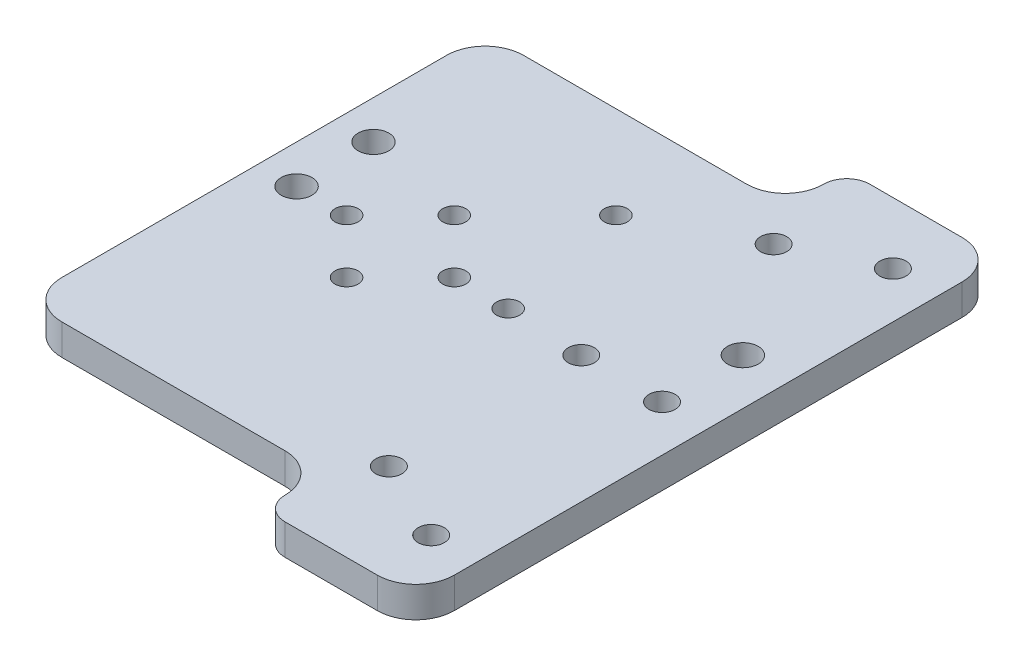
ISO-10303-21;
HEADER;
FILE_DESCRIPTION(('STEP AP214'),'2;1');
FILE_NAME('part.step','',(''),(''),'','','');
FILE_SCHEMA(('AUTOMOTIVE_DESIGN { 1 0 10303 214 1 1 1 1 }'));
ENDSEC;
DATA;
#1=APPLICATION_CONTEXT('core data for automotive mechanical design processes');
#2=APPLICATION_PROTOCOL_DEFINITION('international standard','automotive_design',2000,#1);
#3=PRODUCT_CONTEXT('',#1,'mechanical');
#4=PRODUCT('Part','Part','',(#3));
#5=PRODUCT_RELATED_PRODUCT_CATEGORY('part','',(#4));
#6=PRODUCT_DEFINITION_FORMATION('','',#4);
#7=PRODUCT_DEFINITION_CONTEXT('part definition',#1,'design');
#8=PRODUCT_DEFINITION('design','',#6,#7);
#9=PRODUCT_DEFINITION_SHAPE('','',#8);
#10=(LENGTH_UNIT() NAMED_UNIT(*) SI_UNIT(.MILLI.,.METRE.));
#11=(NAMED_UNIT(*) PLANE_ANGLE_UNIT() SI_UNIT($,.RADIAN.));
#12=(NAMED_UNIT(*) SI_UNIT($,.STERADIAN.) SOLID_ANGLE_UNIT());
#13=UNCERTAINTY_MEASURE_WITH_UNIT(LENGTH_MEASURE(1.E-05),#10,'distance_accuracy_value','');
#14=(GEOMETRIC_REPRESENTATION_CONTEXT(3) GLOBAL_UNCERTAINTY_ASSIGNED_CONTEXT((#13)) GLOBAL_UNIT_ASSIGNED_CONTEXT((#10,
#11,#12)) REPRESENTATION_CONTEXT('',''));
#15=CARTESIAN_POINT('',(0.,0.,0.));
#16=DIRECTION('',(0.,0.,1.));
#17=DIRECTION('',(1.,0.,0.));
#18=AXIS2_PLACEMENT_3D('',#15,#16,#17);
#19=CARTESIAN_POINT('',(0.,4.,0.));
#20=DIRECTION('',(0.,-1.,0.));
#21=DIRECTION('',(0.,0.,-1.));
#22=AXIS2_PLACEMENT_3D('',#19,#20,#21);
#23=PLANE('',#22);
#24=CARTESIAN_POINT('',(32.5,4.,-0.499999999999969));
#25=DIRECTION('',(0.,1.,0.));
#26=DIRECTION('',(0.,0.,1.));
#27=AXIS2_PLACEMENT_3D('',#24,#25,#26);
#28=CIRCLE('',#27,1.5);
#29=CARTESIAN_POINT('',(32.5,4.,1.00000000000004));
#30=VERTEX_POINT('',#29);
#31=EDGE_CURVE('E620',#30,#30,#28,.T.);
#32=ORIENTED_EDGE('',*,*,#31,.F.);
#33=EDGE_LOOP('',(#32));
#34=FACE_BOUND('',#33,.T.);
#35=CARTESIAN_POINT('',(53.,4.,30.));
#36=DIRECTION('',(0.,1.,0.));
#37=DIRECTION('',(0.,0.,1.));
#38=AXIS2_PLACEMENT_3D('',#35,#36,#37);
#39=CIRCLE('',#38,1.7);
#40=CARTESIAN_POINT('',(53.,4.,31.7));
#41=VERTEX_POINT('',#40);
#42=EDGE_CURVE('E636',#41,#41,#39,.T.);
#43=ORIENTED_EDGE('',*,*,#42,.F.);
#44=EDGE_LOOP('',(#43));
#45=FACE_BOUND('',#44,.T.);
#46=CARTESIAN_POINT('',(53.,4.,0.));
#47=DIRECTION('',(0.,1.,0.));
#48=DIRECTION('',(0.,0.,1.));
#49=AXIS2_PLACEMENT_3D('',#46,#47,#48);
#50=CIRCLE('',#49,1.7);
#51=CARTESIAN_POINT('',(53.,4.,1.7));
#52=VERTEX_POINT('',#51);
#53=EDGE_CURVE('E641',#52,#52,#50,.T.);
#54=ORIENTED_EDGE('',*,*,#53,.F.);
#55=EDGE_LOOP('',(#54));
#56=FACE_BOUND('',#55,.T.);
#57=CARTESIAN_POINT('',(53.,4.,-30.));
#58=DIRECTION('',(0.,1.,0.));
#59=DIRECTION('',(0.,0.,1.));
#60=AXIS2_PLACEMENT_3D('',#57,#58,#59);
#61=CIRCLE('',#60,1.7);
#62=CARTESIAN_POINT('',(53.,4.,-28.3));
#63=VERTEX_POINT('',#62);
#64=EDGE_CURVE('E591',#63,#63,#61,.T.);
#65=ORIENTED_EDGE('',*,*,#64,.F.);
#66=EDGE_LOOP('',(#65));
#67=FACE_BOUND('',#66,.T.);
#68=CARTESIAN_POINT('',(42.5,4.,0.));
#69=DIRECTION('',(0.,1.,0.));
#70=DIRECTION('',(0.,0.,1.));
#71=AXIS2_PLACEMENT_3D('',#68,#69,#70);
#72=CIRCLE('',#71,1.7);
#73=CARTESIAN_POINT('',(42.5,4.,1.7));
#74=VERTEX_POINT('',#73);
#75=EDGE_CURVE('E586',#74,#74,#72,.T.);
#76=ORIENTED_EDGE('',*,*,#75,.F.);
#77=EDGE_LOOP('',(#76));
#78=FACE_BOUND('',#77,.T.);
#79=CARTESIAN_POINT('',(42.5,4.,-25.));
#80=DIRECTION('',(0.,1.,0.));
#81=DIRECTION('',(0.,0.,1.));
#82=AXIS2_PLACEMENT_3D('',#79,#80,#81);
#83=CIRCLE('',#82,1.69999999999999);
#84=CARTESIAN_POINT('',(42.5,4.,-23.3));
#85=VERTEX_POINT('',#84);
#86=EDGE_CURVE('E311',#85,#85,#83,.T.);
#87=ORIENTED_EDGE('',*,*,#86,.F.);
#88=EDGE_LOOP('',(#87));
#89=FACE_BOUND('',#88,.T.);
#90=CARTESIAN_POINT('',(42.5,4.,25.));
#91=DIRECTION('',(0.,1.,0.));
#92=DIRECTION('',(0.,0.,1.));
#93=AXIS2_PLACEMENT_3D('',#90,#91,#92);
#94=CIRCLE('',#93,1.69999999999999);
#95=CARTESIAN_POINT('',(42.5,4.,26.7));
#96=VERTEX_POINT('',#95);
#97=EDGE_CURVE('E253',#96,#96,#94,.T.);
#98=ORIENTED_EDGE('',*,*,#97,.F.);
#99=EDGE_LOOP('',(#98));
#100=FACE_BOUND('',#99,.T.);
#101=CARTESIAN_POINT('',(34.,4.,35.));
#102=DIRECTION('',(0.,-1.,0.));
#103=DIRECTION('',(0.,0.,-1.));
#104=AXIS2_PLACEMENT_3D('',#101,#102,#103);
#105=CIRCLE('',#104,5.);
#106=CARTESIAN_POINT('',(34.,4.,30.));
#107=VERTEX_POINT('',#106);
#108=CARTESIAN_POINT('',(39.,4.,35.));
#109=VERTEX_POINT('',#108);
#110=EDGE_CURVE('E217',#107,#109,#105,.T.);
#111=ORIENTED_EDGE('',*,*,#110,.T.);
#112=CARTESIAN_POINT('',(42.,4.,35.));
#113=DIRECTION('',(0.,-1.,0.));
#114=DIRECTION('',(0.,0.,-1.));
#115=AXIS2_PLACEMENT_3D('',#112,#113,#114);
#116=CIRCLE('',#115,3.);
#117=CARTESIAN_POINT('',(42.,4.,38.));
#118=VERTEX_POINT('',#117);
#119=EDGE_CURVE('E42',#109,#118,#116,.F.);
#120=ORIENTED_EDGE('',*,*,#119,.T.);
#121=DIRECTION('',(1.,0.,0.));
#122=VECTOR('',#121,1.);
#123=CARTESIAN_POINT('',(59.,4.,38.));
#124=LINE('',#123,#122);
#125=CARTESIAN_POINT('',(54.,4.,38.));
#126=VERTEX_POINT('',#125);
#127=EDGE_CURVE('E172',#118,#126,#124,.T.);
#128=ORIENTED_EDGE('',*,*,#127,.T.);
#129=CARTESIAN_POINT('',(54.,4.,33.));
#130=DIRECTION('',(0.,-1.,0.));
#131=DIRECTION('',(0.,0.,-1.));
#132=AXIS2_PLACEMENT_3D('',#129,#130,#131);
#133=CIRCLE('',#132,5.);
#134=CARTESIAN_POINT('',(59.,4.,33.));
#135=VERTEX_POINT('',#134);
#136=EDGE_CURVE('E184',#126,#135,#133,.F.);
#137=ORIENTED_EDGE('',*,*,#136,.T.);
#138=DIRECTION('',(0.,0.,-1.));
#139=VECTOR('',#138,1.);
#140=CARTESIAN_POINT('',(59.,4.,-38.));
#141=LINE('',#140,#139);
#142=CARTESIAN_POINT('',(59.,4.,-33.));
#143=VERTEX_POINT('',#142);
#144=EDGE_CURVE('E166',#135,#143,#141,.T.);
#145=ORIENTED_EDGE('',*,*,#144,.T.);
#146=CARTESIAN_POINT('',(54.,4.,-33.));
#147=DIRECTION('',(0.,-1.,0.));
#148=DIRECTION('',(0.,0.,-1.));
#149=AXIS2_PLACEMENT_3D('',#146,#147,#148);
#150=CIRCLE('',#149,5.);
#151=CARTESIAN_POINT('',(54.,4.,-38.));
#152=VERTEX_POINT('',#151);
#153=EDGE_CURVE('E182',#143,#152,#150,.F.);
#154=ORIENTED_EDGE('',*,*,#153,.T.);
#155=DIRECTION('',(-1.,0.,0.));
#156=VECTOR('',#155,1.);
#157=CARTESIAN_POINT('',(39.,4.,-38.));
#158=LINE('',#157,#156);
#159=CARTESIAN_POINT('',(42.,4.,-38.));
#160=VERTEX_POINT('',#159);
#161=EDGE_CURVE('E321',#152,#160,#158,.T.);
#162=ORIENTED_EDGE('',*,*,#161,.T.);
#163=CARTESIAN_POINT('',(42.,4.,-35.));
#164=DIRECTION('',(0.,-1.,0.));
#165=DIRECTION('',(0.,0.,-1.));
#166=AXIS2_PLACEMENT_3D('',#163,#164,#165);
#167=CIRCLE('',#166,3.);
#168=CARTESIAN_POINT('',(39.,4.,-35.));
#169=VERTEX_POINT('',#168);
#170=EDGE_CURVE('E225',#160,#169,#167,.F.);
#171=ORIENTED_EDGE('',*,*,#170,.T.);
#172=CARTESIAN_POINT('',(34.,4.,-35.));
#173=DIRECTION('',(0.,-1.,0.));
#174=DIRECTION('',(0.,0.,-1.));
#175=AXIS2_PLACEMENT_3D('',#172,#173,#174);
#176=CIRCLE('',#175,5.);
#177=CARTESIAN_POINT('',(34.,4.,-30.));
#178=VERTEX_POINT('',#177);
#179=EDGE_CURVE('E214',#169,#178,#176,.T.);
#180=ORIENTED_EDGE('',*,*,#179,.T.);
#181=DIRECTION('',(-1.,0.,0.));
#182=VECTOR('',#181,1.);
#183=CARTESIAN_POINT('',(0.,4.,-30.));
#184=LINE('',#183,#182);
#185=CARTESIAN_POINT('',(5.,4.,-30.));
#186=VERTEX_POINT('',#185);
#187=EDGE_CURVE('E245',#178,#186,#184,.T.);
#188=ORIENTED_EDGE('',*,*,#187,.T.);
#189=CARTESIAN_POINT('',(5.,4.,-25.));
#190=DIRECTION('',(0.,-1.,0.));
#191=DIRECTION('',(0.,0.,-1.));
#192=AXIS2_PLACEMENT_3D('',#189,#190,#191);
#193=CIRCLE('',#192,5.);
#194=CARTESIAN_POINT('',(0.,4.,-25.));
#195=VERTEX_POINT('',#194);
#196=EDGE_CURVE('E186',#186,#195,#193,.F.);
#197=ORIENTED_EDGE('',*,*,#196,.T.);
#198=DIRECTION('',(0.,0.,1.));
#199=VECTOR('',#198,1.);
#200=CARTESIAN_POINT('',(0.,4.,0.));
#201=LINE('',#200,#199);
#202=CARTESIAN_POINT('',(0.,4.,25.));
#203=VERTEX_POINT('',#202);
#204=EDGE_CURVE('E243',#195,#203,#201,.T.);
#205=ORIENTED_EDGE('',*,*,#204,.T.);
#206=CARTESIAN_POINT('',(5.,4.,25.));
#207=DIRECTION('',(0.,-1.,0.));
#208=DIRECTION('',(0.,0.,-1.));
#209=AXIS2_PLACEMENT_3D('',#206,#207,#208);
#210=CIRCLE('',#209,5.);
#211=CARTESIAN_POINT('',(5.,4.,30.));
#212=VERTEX_POINT('',#211);
#213=EDGE_CURVE('E188',#203,#212,#210,.F.);
#214=ORIENTED_EDGE('',*,*,#213,.T.);
#215=DIRECTION('',(1.,0.,0.));
#216=VECTOR('',#215,1.);
#217=CARTESIAN_POINT('',(39.,4.,30.));
#218=LINE('',#217,#216);
#219=EDGE_CURVE('E154',#212,#107,#218,.T.);
#220=ORIENTED_EDGE('',*,*,#219,.T.);
#221=EDGE_LOOP('',(#111,#120,#128,#137,#145,#154,#162,#171,#180,#188,#197,#205,#214,#220));
#222=FACE_BOUND('',#221,.T.);
#223=CARTESIAN_POINT('',(5.,4.,-10.5));
#224=DIRECTION('',(0.,1.,0.));
#225=DIRECTION('',(0.,0.,1.));
#226=AXIS2_PLACEMENT_3D('',#223,#224,#225);
#227=CIRCLE('',#226,2.);
#228=CARTESIAN_POINT('',(5.,4.,-8.49999999999996));
#229=VERTEX_POINT('',#228);
#230=EDGE_CURVE('E632',#229,#229,#227,.F.);
#231=ORIENTED_EDGE('',*,*,#230,.T.);
#232=EDGE_LOOP('',(#231));
#233=FACE_BOUND('',#232,.T.);
#234=CARTESIAN_POINT('',(5.,4.,-0.499999999999963));
#235=DIRECTION('',(0.,1.,0.));
#236=DIRECTION('',(0.,0.,1.));
#237=AXIS2_PLACEMENT_3D('',#234,#235,#236);
#238=CIRCLE('',#237,2.);
#239=CARTESIAN_POINT('',(5.,4.,1.50000000000004));
#240=VERTEX_POINT('',#239);
#241=EDGE_CURVE('E661',#240,#240,#238,.F.);
#242=ORIENTED_EDGE('',*,*,#241,.T.);
#243=EDGE_LOOP('',(#242));
#244=FACE_BOUND('',#243,.T.);
#245=CARTESIAN_POINT('',(11.5,4.,-0.499999999999965));
#246=DIRECTION('',(0.,1.,0.));
#247=DIRECTION('',(0.,0.,1.));
#248=AXIS2_PLACEMENT_3D('',#245,#246,#247);
#249=CIRCLE('',#248,1.5);
#250=CARTESIAN_POINT('',(11.5,4.,1.00000000000004));
#251=VERTEX_POINT('',#250);
#252=EDGE_CURVE('E670',#251,#251,#249,.F.);
#253=ORIENTED_EDGE('',*,*,#252,.T.);
#254=EDGE_LOOP('',(#253));
#255=FACE_BOUND('',#254,.T.);
#256=CARTESIAN_POINT('',(18.5,4.,-7.49999999999997));
#257=DIRECTION('',(0.,1.,0.));
#258=DIRECTION('',(0.,0.,1.));
#259=AXIS2_PLACEMENT_3D('',#256,#257,#258);
#260=CIRCLE('',#259,1.5);
#261=CARTESIAN_POINT('',(18.5,4.,-5.99999999999996));
#262=VERTEX_POINT('',#261);
#263=EDGE_CURVE('E676',#262,#262,#260,.F.);
#264=ORIENTED_EDGE('',*,*,#263,.T.);
#265=EDGE_LOOP('',(#264));
#266=FACE_BOUND('',#265,.T.);
#267=CARTESIAN_POINT('',(18.5,4.,6.50000000000003));
#268=DIRECTION('',(0.,1.,0.));
#269=DIRECTION('',(0.,0.,1.));
#270=AXIS2_PLACEMENT_3D('',#267,#268,#269);
#271=CIRCLE('',#270,1.5);
#272=CARTESIAN_POINT('',(18.5,4.,8.00000000000004));
#273=VERTEX_POINT('',#272);
#274=EDGE_CURVE('E682',#273,#273,#271,.F.);
#275=ORIENTED_EDGE('',*,*,#274,.T.);
#276=EDGE_LOOP('',(#275));
#277=FACE_BOUND('',#276,.T.);
#278=CARTESIAN_POINT('',(25.5,4.,-0.499999999999969));
#279=DIRECTION('',(0.,1.,0.));
#280=DIRECTION('',(0.,0.,1.));
#281=AXIS2_PLACEMENT_3D('',#278,#279,#280);
#282=CIRCLE('',#281,1.5);
#283=CARTESIAN_POINT('',(25.5,4.,1.00000000000004));
#284=VERTEX_POINT('',#283);
#285=EDGE_CURVE('E688',#284,#284,#282,.F.);
#286=ORIENTED_EDGE('',*,*,#285,.T.);
#287=EDGE_LOOP('',(#286));
#288=FACE_BOUND('',#287,.T.);
#289=CARTESIAN_POINT('',(29.,4.,-18.));
#290=DIRECTION('',(0.,1.,0.));
#291=DIRECTION('',(0.,0.,1.));
#292=AXIS2_PLACEMENT_3D('',#289,#290,#291);
#293=CIRCLE('',#292,1.5);
#294=CARTESIAN_POINT('',(29.,4.,-16.5));
#295=VERTEX_POINT('',#294);
#296=EDGE_CURVE('E692',#295,#295,#293,.T.);
#297=ORIENTED_EDGE('',*,*,#296,.F.);
#298=EDGE_LOOP('',(#297));
#299=FACE_BOUND('',#298,.T.);
#300=CARTESIAN_POINT('',(53.,4.,-10.5));
#301=DIRECTION('',(0.,1.,0.));
#302=DIRECTION('',(0.,0.,1.));
#303=AXIS2_PLACEMENT_3D('',#300,#301,#302);
#304=CIRCLE('',#303,2.);
#305=CARTESIAN_POINT('',(53.,4.,-8.49999999999996));
#306=VERTEX_POINT('',#305);
#307=EDGE_CURVE('E621',#306,#306,#304,.T.);
#308=ORIENTED_EDGE('',*,*,#307,.F.);
#309=EDGE_LOOP('',(#308));
#310=FACE_BOUND('',#309,.T.);
#311=ADVANCED_FACE('F34',(#34,#45,#56,#67,#78,#89,#100,#222,#233,#244,#255,#266,#277,#288,#299,
#310),#23,.F.);
#312=CARTESIAN_POINT('',(0.,0.,0.));
#313=DIRECTION('',(0.,-1.,0.));
#314=DIRECTION('',(0.,0.,-1.));
#315=AXIS2_PLACEMENT_3D('',#312,#313,#314);
#316=PLANE('',#315);
#317=CARTESIAN_POINT('',(25.5,0.,-0.499999999999969));
#318=DIRECTION('',(0.,1.,0.));
#319=DIRECTION('',(0.,0.,1.));
#320=AXIS2_PLACEMENT_3D('',#317,#318,#319);
#321=CIRCLE('',#320,1.5);
#322=CARTESIAN_POINT('',(25.5,0.,1.00000000000004));
#323=VERTEX_POINT('',#322);
#324=EDGE_CURVE('E685',#323,#323,#321,.F.);
#325=ORIENTED_EDGE('',*,*,#324,.F.);
#326=EDGE_LOOP('',(#325));
#327=FACE_BOUND('',#326,.T.);
#328=CARTESIAN_POINT('',(18.5,0.,6.50000000000003));
#329=DIRECTION('',(0.,1.,0.));
#330=DIRECTION('',(0.,0.,1.));
#331=AXIS2_PLACEMENT_3D('',#328,#329,#330);
#332=CIRCLE('',#331,1.5);
#333=CARTESIAN_POINT('',(18.5,0.,8.00000000000004));
#334=VERTEX_POINT('',#333);
#335=EDGE_CURVE('E679',#334,#334,#332,.F.);
#336=ORIENTED_EDGE('',*,*,#335,.F.);
#337=EDGE_LOOP('',(#336));
#338=FACE_BOUND('',#337,.T.);
#339=CARTESIAN_POINT('',(18.5,0.,-7.49999999999997));
#340=DIRECTION('',(0.,1.,0.));
#341=DIRECTION('',(0.,0.,1.));
#342=AXIS2_PLACEMENT_3D('',#339,#340,#341);
#343=CIRCLE('',#342,1.5);
#344=CARTESIAN_POINT('',(18.5,0.,-5.99999999999996));
#345=VERTEX_POINT('',#344);
#346=EDGE_CURVE('E673',#345,#345,#343,.F.);
#347=ORIENTED_EDGE('',*,*,#346,.F.);
#348=EDGE_LOOP('',(#347));
#349=FACE_BOUND('',#348,.T.);
#350=CARTESIAN_POINT('',(11.5,0.,-0.499999999999965));
#351=DIRECTION('',(0.,1.,0.));
#352=DIRECTION('',(0.,0.,1.));
#353=AXIS2_PLACEMENT_3D('',#350,#351,#352);
#354=CIRCLE('',#353,1.5);
#355=CARTESIAN_POINT('',(11.5,0.,1.00000000000004));
#356=VERTEX_POINT('',#355);
#357=EDGE_CURVE('E665',#356,#356,#354,.F.);
#358=ORIENTED_EDGE('',*,*,#357,.F.);
#359=EDGE_LOOP('',(#358));
#360=FACE_BOUND('',#359,.T.);
#361=CARTESIAN_POINT('',(5.,0.,-0.499999999999963));
#362=DIRECTION('',(0.,1.,0.));
#363=DIRECTION('',(0.,0.,1.));
#364=AXIS2_PLACEMENT_3D('',#361,#362,#363);
#365=CIRCLE('',#364,2.);
#366=CARTESIAN_POINT('',(5.,0.,1.50000000000004));
#367=VERTEX_POINT('',#366);
#368=EDGE_CURVE('E635',#367,#367,#365,.F.);
#369=ORIENTED_EDGE('',*,*,#368,.F.);
#370=EDGE_LOOP('',(#369));
#371=FACE_BOUND('',#370,.T.);
#372=CARTESIAN_POINT('',(5.,0.,-10.5));
#373=DIRECTION('',(0.,1.,0.));
#374=DIRECTION('',(0.,0.,1.));
#375=AXIS2_PLACEMENT_3D('',#372,#373,#374);
#376=CIRCLE('',#375,2.);
#377=CARTESIAN_POINT('',(5.,0.,-8.49999999999996));
#378=VERTEX_POINT('',#377);
#379=EDGE_CURVE('E629',#378,#378,#376,.F.);
#380=ORIENTED_EDGE('',*,*,#379,.F.);
#381=EDGE_LOOP('',(#380));
#382=FACE_BOUND('',#381,.T.);
#383=CARTESIAN_POINT('',(53.,0.,0.));
#384=DIRECTION('',(0.,1.,0.));
#385=DIRECTION('',(0.,0.,1.));
#386=AXIS2_PLACEMENT_3D('',#383,#384,#385);
#387=CIRCLE('',#386,1.7);
#388=CARTESIAN_POINT('',(53.,0.,1.7));
#389=VERTEX_POINT('',#388);
#390=EDGE_CURVE('E639',#389,#389,#387,.T.);
#391=ORIENTED_EDGE('',*,*,#390,.T.);
#392=EDGE_LOOP('',(#391));
#393=FACE_BOUND('',#392,.T.);
#394=CARTESIAN_POINT('',(42.5,0.,0.));
#395=DIRECTION('',(0.,1.,0.));
#396=DIRECTION('',(0.,0.,1.));
#397=AXIS2_PLACEMENT_3D('',#394,#395,#396);
#398=CIRCLE('',#397,1.7);
#399=CARTESIAN_POINT('',(42.5,0.,1.7));
#400=VERTEX_POINT('',#399);
#401=EDGE_CURVE('E589',#400,#400,#398,.T.);
#402=ORIENTED_EDGE('',*,*,#401,.T.);
#403=EDGE_LOOP('',(#402));
#404=FACE_BOUND('',#403,.T.);
#405=CARTESIAN_POINT('',(42.5,0.,25.));
#406=DIRECTION('',(0.,1.,0.));
#407=DIRECTION('',(0.,0.,1.));
#408=AXIS2_PLACEMENT_3D('',#405,#406,#407);
#409=CIRCLE('',#408,1.69999999999999);
#410=CARTESIAN_POINT('',(42.5,0.,26.7));
#411=VERTEX_POINT('',#410);
#412=EDGE_CURVE('E309',#411,#411,#409,.T.);
#413=ORIENTED_EDGE('',*,*,#412,.T.);
#414=EDGE_LOOP('',(#413));
#415=FACE_BOUND('',#414,.T.);
#416=DIRECTION('',(1.,0.,0.));
#417=VECTOR('',#416,1.);
#418=CARTESIAN_POINT('',(59.,0.,38.));
#419=LINE('',#418,#417);
#420=CARTESIAN_POINT('',(42.,0.,38.));
#421=VERTEX_POINT('',#420);
#422=CARTESIAN_POINT('',(54.,0.,38.));
#423=VERTEX_POINT('',#422);
#424=EDGE_CURVE('E163',#421,#423,#419,.T.);
#425=ORIENTED_EDGE('',*,*,#424,.F.);
#426=CARTESIAN_POINT('',(42.,0.,35.));
#427=DIRECTION('',(0.,-1.,0.));
#428=DIRECTION('',(0.,0.,-1.));
#429=AXIS2_PLACEMENT_3D('',#426,#427,#428);
#430=CIRCLE('',#429,3.);
#431=CARTESIAN_POINT('',(39.,0.,35.));
#432=VERTEX_POINT('',#431);
#433=EDGE_CURVE('E223',#421,#432,#430,.T.);
#434=ORIENTED_EDGE('',*,*,#433,.T.);
#435=CARTESIAN_POINT('',(34.,0.,35.));
#436=DIRECTION('',(0.,-1.,0.));
#437=DIRECTION('',(0.,0.,-1.));
#438=AXIS2_PLACEMENT_3D('',#435,#436,#437);
#439=CIRCLE('',#438,5.);
#440=CARTESIAN_POINT('',(34.,0.,30.));
#441=VERTEX_POINT('',#440);
#442=EDGE_CURVE('E162',#432,#441,#439,.F.);
#443=ORIENTED_EDGE('',*,*,#442,.T.);
#444=DIRECTION('',(1.,0.,0.));
#445=VECTOR('',#444,1.);
#446=CARTESIAN_POINT('',(39.,0.,30.));
#447=LINE('',#446,#445);
#448=CARTESIAN_POINT('',(5.,0.,30.));
#449=VERTEX_POINT('',#448);
#450=EDGE_CURVE('E151',#449,#441,#447,.T.);
#451=ORIENTED_EDGE('',*,*,#450,.F.);
#452=CARTESIAN_POINT('',(5.,0.,25.));
#453=DIRECTION('',(0.,-1.,0.));
#454=DIRECTION('',(0.,0.,-1.));
#455=AXIS2_PLACEMENT_3D('',#452,#453,#454);
#456=CIRCLE('',#455,5.);
#457=CARTESIAN_POINT('',(0.,0.,25.));
#458=VERTEX_POINT('',#457);
#459=EDGE_CURVE('E135',#449,#458,#456,.T.);
#460=ORIENTED_EDGE('',*,*,#459,.T.);
#461=DIRECTION('',(0.,0.,1.));
#462=VECTOR('',#461,1.);
#463=CARTESIAN_POINT('',(0.,0.,30.));
#464=LINE('',#463,#462);
#465=CARTESIAN_POINT('',(0.,0.,-25.));
#466=VERTEX_POINT('',#465);
#467=EDGE_CURVE('E164',#466,#458,#464,.T.);
#468=ORIENTED_EDGE('',*,*,#467,.F.);
#469=CARTESIAN_POINT('',(5.,0.,-25.));
#470=DIRECTION('',(0.,-1.,0.));
#471=DIRECTION('',(0.,0.,-1.));
#472=AXIS2_PLACEMENT_3D('',#469,#470,#471);
#473=CIRCLE('',#472,5.);
#474=CARTESIAN_POINT('',(5.,0.,-30.));
#475=VERTEX_POINT('',#474);
#476=EDGE_CURVE('E145',#466,#475,#473,.T.);
#477=ORIENTED_EDGE('',*,*,#476,.T.);
#478=DIRECTION('',(-1.,0.,0.));
#479=VECTOR('',#478,1.);
#480=CARTESIAN_POINT('',(0.,0.,-30.));
#481=LINE('',#480,#479);
#482=CARTESIAN_POINT('',(34.,0.,-30.));
#483=VERTEX_POINT('',#482);
#484=EDGE_CURVE('E168',#483,#475,#481,.T.);
#485=ORIENTED_EDGE('',*,*,#484,.F.);
#486=CARTESIAN_POINT('',(34.,0.,-35.));
#487=DIRECTION('',(0.,-1.,0.));
#488=DIRECTION('',(0.,0.,-1.));
#489=AXIS2_PLACEMENT_3D('',#486,#487,#488);
#490=CIRCLE('',#489,5.);
#491=CARTESIAN_POINT('',(39.,0.,-35.));
#492=VERTEX_POINT('',#491);
#493=EDGE_CURVE('E212',#483,#492,#490,.F.);
#494=ORIENTED_EDGE('',*,*,#493,.T.);
#495=CARTESIAN_POINT('',(42.,0.,-35.));
#496=DIRECTION('',(0.,-1.,0.));
#497=DIRECTION('',(0.,0.,-1.));
#498=AXIS2_PLACEMENT_3D('',#495,#496,#497);
#499=CIRCLE('',#498,3.);
#500=CARTESIAN_POINT('',(42.,0.,-38.));
#501=VERTEX_POINT('',#500);
#502=EDGE_CURVE('E55',#492,#501,#499,.T.);
#503=ORIENTED_EDGE('',*,*,#502,.T.);
#504=DIRECTION('',(-1.,0.,0.));
#505=VECTOR('',#504,1.);
#506=CARTESIAN_POINT('',(39.,0.,-38.));
#507=LINE('',#506,#505);
#508=CARTESIAN_POINT('',(54.,0.,-38.));
#509=VERTEX_POINT('',#508);
#510=EDGE_CURVE('E252',#509,#501,#507,.T.);
#511=ORIENTED_EDGE('',*,*,#510,.F.);
#512=CARTESIAN_POINT('',(54.,0.,-33.));
#513=DIRECTION('',(0.,-1.,0.));
#514=DIRECTION('',(0.,0.,-1.));
#515=AXIS2_PLACEMENT_3D('',#512,#513,#514);
#516=CIRCLE('',#515,5.);
#517=CARTESIAN_POINT('',(59.,0.,-33.));
#518=VERTEX_POINT('',#517);
#519=EDGE_CURVE('E155',#509,#518,#516,.T.);
#520=ORIENTED_EDGE('',*,*,#519,.T.);
#521=DIRECTION('',(0.,0.,-1.));
#522=VECTOR('',#521,1.);
#523=CARTESIAN_POINT('',(59.,0.,-38.));
#524=LINE('',#523,#522);
#525=CARTESIAN_POINT('',(59.,0.,33.));
#526=VERTEX_POINT('',#525);
#527=EDGE_CURVE('E249',#526,#518,#524,.T.);
#528=ORIENTED_EDGE('',*,*,#527,.F.);
#529=CARTESIAN_POINT('',(54.,0.,33.));
#530=DIRECTION('',(0.,-1.,0.));
#531=DIRECTION('',(0.,0.,-1.));
#532=AXIS2_PLACEMENT_3D('',#529,#530,#531);
#533=CIRCLE('',#532,5.);
#534=EDGE_CURVE('E175',#526,#423,#533,.T.);
#535=ORIENTED_EDGE('',*,*,#534,.T.);
#536=EDGE_LOOP('',(#425,#434,#443,#451,#460,#468,#477,#485,#494,#503,#511,#520,#528,#535));
#537=FACE_BOUND('',#536,.T.);
#538=CARTESIAN_POINT('',(42.5,0.,-25.));
#539=DIRECTION('',(0.,1.,0.));
#540=DIRECTION('',(0.,0.,1.));
#541=AXIS2_PLACEMENT_3D('',#538,#539,#540);
#542=CIRCLE('',#541,1.69999999999999);
#543=CARTESIAN_POINT('',(42.5,0.,-23.3));
#544=VERTEX_POINT('',#543);
#545=EDGE_CURVE('E315',#544,#544,#542,.T.);
#546=ORIENTED_EDGE('',*,*,#545,.T.);
#547=EDGE_LOOP('',(#546));
#548=FACE_BOUND('',#547,.T.);
#549=CARTESIAN_POINT('',(53.,0.,-30.));
#550=DIRECTION('',(0.,1.,0.));
#551=DIRECTION('',(0.,0.,1.));
#552=AXIS2_PLACEMENT_3D('',#549,#550,#551);
#553=CIRCLE('',#552,1.7);
#554=CARTESIAN_POINT('',(53.,0.,-28.3));
#555=VERTEX_POINT('',#554);
#556=EDGE_CURVE('E595',#555,#555,#553,.T.);
#557=ORIENTED_EDGE('',*,*,#556,.T.);
#558=EDGE_LOOP('',(#557));
#559=FACE_BOUND('',#558,.T.);
#560=CARTESIAN_POINT('',(53.,0.,30.));
#561=DIRECTION('',(0.,1.,0.));
#562=DIRECTION('',(0.,0.,1.));
#563=AXIS2_PLACEMENT_3D('',#560,#561,#562);
#564=CIRCLE('',#563,1.7);
#565=CARTESIAN_POINT('',(53.,0.,31.7));
#566=VERTEX_POINT('',#565);
#567=EDGE_CURVE('E608',#566,#566,#564,.T.);
#568=ORIENTED_EDGE('',*,*,#567,.T.);
#569=EDGE_LOOP('',(#568));
#570=FACE_BOUND('',#569,.T.);
#571=CARTESIAN_POINT('',(29.,0.,-18.));
#572=DIRECTION('',(0.,1.,0.));
#573=DIRECTION('',(0.,0.,1.));
#574=AXIS2_PLACEMENT_3D('',#571,#572,#573);
#575=CIRCLE('',#574,1.5);
#576=CARTESIAN_POINT('',(29.,0.,-16.5));
#577=VERTEX_POINT('',#576);
#578=EDGE_CURVE('E612',#577,#577,#575,.T.);
#579=ORIENTED_EDGE('',*,*,#578,.T.);
#580=EDGE_LOOP('',(#579));
#581=FACE_BOUND('',#580,.T.);
#582=CARTESIAN_POINT('',(32.5,0.,-0.499999999999969));
#583=DIRECTION('',(0.,1.,0.));
#584=DIRECTION('',(0.,0.,1.));
#585=AXIS2_PLACEMENT_3D('',#582,#583,#584);
#586=CIRCLE('',#585,1.5);
#587=CARTESIAN_POINT('',(32.5,0.,1.00000000000004));
#588=VERTEX_POINT('',#587);
#589=EDGE_CURVE('E616',#588,#588,#586,.T.);
#590=ORIENTED_EDGE('',*,*,#589,.T.);
#591=EDGE_LOOP('',(#590));
#592=FACE_BOUND('',#591,.T.);
#593=CARTESIAN_POINT('',(53.,0.,-10.5));
#594=DIRECTION('',(0.,1.,0.));
#595=DIRECTION('',(0.,0.,1.));
#596=AXIS2_PLACEMENT_3D('',#593,#594,#595);
#597=CIRCLE('',#596,2.);
#598=CARTESIAN_POINT('',(53.,0.,-8.49999999999996));
#599=VERTEX_POINT('',#598);
#600=EDGE_CURVE('E619',#599,#599,#597,.T.);
#601=ORIENTED_EDGE('',*,*,#600,.T.);
#602=EDGE_LOOP('',(#601));
#603=FACE_BOUND('',#602,.T.);
#604=ADVANCED_FACE('F159',(#327,#338,#349,#360,#371,#382,#393,#404,#415,#537,#548,#559,#570,
#581,#592,#603),#316,.T.);
#605=CARTESIAN_POINT('',(59.,4.,-38.));
#606=DIRECTION('',(-1.,0.,0.));
#607=DIRECTION('',(0.,0.,1.));
#608=AXIS2_PLACEMENT_3D('',#605,#606,#607);
#609=PLANE('',#608);
#610=ORIENTED_EDGE('',*,*,#144,.F.);
#611=DIRECTION('',(0.,-1.,0.));
#612=VECTOR('',#611,1.);
#613=CARTESIAN_POINT('',(59.,4.,33.));
#614=LINE('',#613,#612);
#615=EDGE_CURVE('E203',#135,#526,#614,.T.);
#616=ORIENTED_EDGE('',*,*,#615,.T.);
#617=ORIENTED_EDGE('',*,*,#527,.T.);
#618=DIRECTION('',(0.,-1.,0.));
#619=VECTOR('',#618,1.);
#620=CARTESIAN_POINT('',(59.,4.,-33.));
#621=LINE('',#620,#619);
#622=EDGE_CURVE('E201',#518,#143,#621,.F.);
#623=ORIENTED_EDGE('',*,*,#622,.T.);
#624=EDGE_LOOP('',(#610,#616,#617,#623));
#625=FACE_BOUND('',#624,.T.);
#626=ADVANCED_FACE('F284',(#625),#609,.F.);
#627=CARTESIAN_POINT('',(39.,4.,-38.));
#628=DIRECTION('',(0.,0.,1.));
#629=DIRECTION('',(1.,0.,0.));
#630=AXIS2_PLACEMENT_3D('',#627,#628,#629);
#631=PLANE('',#630);
#632=ORIENTED_EDGE('',*,*,#510,.T.);
#633=DIRECTION('',(0.,-1.,0.));
#634=VECTOR('',#633,1.);
#635=CARTESIAN_POINT('',(42.,4.,-38.));
#636=LINE('',#635,#634);
#637=EDGE_CURVE('E11',#501,#160,#636,.F.);
#638=ORIENTED_EDGE('',*,*,#637,.T.);
#639=ORIENTED_EDGE('',*,*,#161,.F.);
#640=DIRECTION('',(0.,-1.,0.));
#641=VECTOR('',#640,1.);
#642=CARTESIAN_POINT('',(54.,4.,-38.));
#643=LINE('',#642,#641);
#644=EDGE_CURVE('E209',#152,#509,#643,.T.);
#645=ORIENTED_EDGE('',*,*,#644,.T.);
#646=EDGE_LOOP('',(#632,#638,#639,#645));
#647=FACE_BOUND('',#646,.T.);
#648=ADVANCED_FACE('F276',(#647),#631,.F.);
#649=CARTESIAN_POINT('',(0.,4.,-30.));
#650=DIRECTION('',(0.,0.,1.));
#651=DIRECTION('',(1.,0.,0.));
#652=AXIS2_PLACEMENT_3D('',#649,#650,#651);
#653=PLANE('',#652);
#654=ORIENTED_EDGE('',*,*,#484,.T.);
#655=DIRECTION('',(0.,-1.,0.));
#656=VECTOR('',#655,1.);
#657=CARTESIAN_POINT('',(5.,4.,-30.));
#658=LINE('',#657,#656);
#659=EDGE_CURVE('E193',#475,#186,#658,.F.);
#660=ORIENTED_EDGE('',*,*,#659,.T.);
#661=ORIENTED_EDGE('',*,*,#187,.F.);
#662=DIRECTION('',(0.,-1.,0.));
#663=VECTOR('',#662,1.);
#664=CARTESIAN_POINT('',(34.,0.,-30.));
#665=LINE('',#664,#663);
#666=EDGE_CURVE('E190',#178,#483,#665,.T.);
#667=ORIENTED_EDGE('',*,*,#666,.T.);
#668=EDGE_LOOP('',(#654,#660,#661,#667));
#669=FACE_BOUND('',#668,.T.);
#670=ADVANCED_FACE('F258',(#669),#653,.F.);
#671=CARTESIAN_POINT('',(0.,4.,30.));
#672=DIRECTION('',(1.,0.,0.));
#673=DIRECTION('',(0.,0.,-1.));
#674=AXIS2_PLACEMENT_3D('',#671,#672,#673);
#675=PLANE('',#674);
#676=ORIENTED_EDGE('',*,*,#467,.T.);
#677=DIRECTION('',(0.,-1.,0.));
#678=VECTOR('',#677,1.);
#679=CARTESIAN_POINT('',(0.,4.,25.));
#680=LINE('',#679,#678);
#681=EDGE_CURVE('E140',#458,#203,#680,.F.);
#682=ORIENTED_EDGE('',*,*,#681,.T.);
#683=ORIENTED_EDGE('',*,*,#204,.F.);
#684=DIRECTION('',(0.,-1.,0.));
#685=VECTOR('',#684,1.);
#686=CARTESIAN_POINT('',(0.,4.,-25.));
#687=LINE('',#686,#685);
#688=EDGE_CURVE('E144',#195,#466,#687,.T.);
#689=ORIENTED_EDGE('',*,*,#688,.T.);
#690=EDGE_LOOP('',(#676,#682,#683,#689));
#691=FACE_BOUND('',#690,.T.);
#692=ADVANCED_FACE('F268',(#691),#675,.F.);
#693=CARTESIAN_POINT('',(39.,4.,30.));
#694=DIRECTION('',(0.,0.,-1.));
#695=DIRECTION('',(-1.,0.,0.));
#696=AXIS2_PLACEMENT_3D('',#693,#694,#695);
#697=PLANE('',#696);
#698=ORIENTED_EDGE('',*,*,#219,.F.);
#699=DIRECTION('',(0.,-1.,0.));
#700=VECTOR('',#699,1.);
#701=CARTESIAN_POINT('',(5.,4.,30.));
#702=LINE('',#701,#700);
#703=EDGE_CURVE('E139',#212,#449,#702,.T.);
#704=ORIENTED_EDGE('',*,*,#703,.T.);
#705=ORIENTED_EDGE('',*,*,#450,.T.);
#706=DIRECTION('',(0.,-1.,0.));
#707=VECTOR('',#706,1.);
#708=CARTESIAN_POINT('',(34.,4.,30.));
#709=LINE('',#708,#707);
#710=EDGE_CURVE('E156',#441,#107,#709,.F.);
#711=ORIENTED_EDGE('',*,*,#710,.T.);
#712=EDGE_LOOP('',(#698,#704,#705,#711));
#713=FACE_BOUND('',#712,.T.);
#714=ADVANCED_FACE('F150',(#713),#697,.F.);
#715=CARTESIAN_POINT('',(59.,4.,38.));
#716=DIRECTION('',(0.,0.,-1.));
#717=DIRECTION('',(-1.,0.,0.));
#718=AXIS2_PLACEMENT_3D('',#715,#716,#717);
#719=PLANE('',#718);
#720=ORIENTED_EDGE('',*,*,#127,.F.);
#721=DIRECTION('',(0.,-1.,0.));
#722=VECTOR('',#721,1.);
#723=CARTESIAN_POINT('',(42.,4.,38.));
#724=LINE('',#723,#722);
#725=EDGE_CURVE('E219',#118,#421,#724,.T.);
#726=ORIENTED_EDGE('',*,*,#725,.T.);
#727=ORIENTED_EDGE('',*,*,#424,.T.);
#728=DIRECTION('',(0.,-1.,0.));
#729=VECTOR('',#728,1.);
#730=CARTESIAN_POINT('',(54.,4.,38.));
#731=LINE('',#730,#729);
#732=EDGE_CURVE('E206',#423,#126,#731,.F.);
#733=ORIENTED_EDGE('',*,*,#732,.T.);
#734=EDGE_LOOP('',(#720,#726,#727,#733));
#735=FACE_BOUND('',#734,.T.);
#736=ADVANCED_FACE('F235',(#735),#719,.F.);
#737=CARTESIAN_POINT('',(42.5,4.,25.));
#738=DIRECTION('',(0.,-1.,0.));
#739=DIRECTION('',(0.,0.,-1.));
#740=AXIS2_PLACEMENT_3D('',#737,#738,#739);
#741=CYLINDRICAL_SURFACE('',#740,1.69999999999999);
#742=ORIENTED_EDGE('',*,*,#97,.T.);
#743=EDGE_LOOP('',(#742));
#744=FACE_BOUND('',#743,.T.);
#745=ORIENTED_EDGE('',*,*,#412,.F.);
#746=EDGE_LOOP('',(#745));
#747=FACE_BOUND('',#746,.T.);
#748=ADVANCED_FACE('F290',(#744,#747),#741,.F.);
#749=CARTESIAN_POINT('',(42.5,4.,-25.));
#750=DIRECTION('',(0.,-1.,0.));
#751=DIRECTION('',(0.,0.,-1.));
#752=AXIS2_PLACEMENT_3D('',#749,#750,#751);
#753=CYLINDRICAL_SURFACE('',#752,1.69999999999999);
#754=ORIENTED_EDGE('',*,*,#86,.T.);
#755=EDGE_LOOP('',(#754));
#756=FACE_BOUND('',#755,.T.);
#757=ORIENTED_EDGE('',*,*,#545,.F.);
#758=EDGE_LOOP('',(#757));
#759=FACE_BOUND('',#758,.T.);
#760=ADVANCED_FACE('F297',(#756,#759),#753,.F.);
#761=CARTESIAN_POINT('',(42.5,4.,0.));
#762=DIRECTION('',(0.,-1.,0.));
#763=DIRECTION('',(0.,0.,-1.));
#764=AXIS2_PLACEMENT_3D('',#761,#762,#763);
#765=CYLINDRICAL_SURFACE('',#764,1.7);
#766=ORIENTED_EDGE('',*,*,#75,.T.);
#767=EDGE_LOOP('',(#766));
#768=FACE_BOUND('',#767,.T.);
#769=ORIENTED_EDGE('',*,*,#401,.F.);
#770=EDGE_LOOP('',(#769));
#771=FACE_BOUND('',#770,.T.);
#772=ADVANCED_FACE('F302',(#768,#771),#765,.F.);
#773=CARTESIAN_POINT('',(53.,4.,-30.));
#774=DIRECTION('',(0.,-1.,0.));
#775=DIRECTION('',(0.,0.,-1.));
#776=AXIS2_PLACEMENT_3D('',#773,#774,#775);
#777=CYLINDRICAL_SURFACE('',#776,1.7);
#778=ORIENTED_EDGE('',*,*,#64,.T.);
#779=EDGE_LOOP('',(#778));
#780=FACE_BOUND('',#779,.T.);
#781=ORIENTED_EDGE('',*,*,#556,.F.);
#782=EDGE_LOOP('',(#781));
#783=FACE_BOUND('',#782,.T.);
#784=ADVANCED_FACE('F551',(#780,#783),#777,.F.);
#785=CARTESIAN_POINT('',(53.,4.,0.));
#786=DIRECTION('',(0.,-1.,0.));
#787=DIRECTION('',(0.,0.,-1.));
#788=AXIS2_PLACEMENT_3D('',#785,#786,#787);
#789=CYLINDRICAL_SURFACE('',#788,1.7);
#790=ORIENTED_EDGE('',*,*,#53,.T.);
#791=EDGE_LOOP('',(#790));
#792=FACE_BOUND('',#791,.T.);
#793=ORIENTED_EDGE('',*,*,#390,.F.);
#794=EDGE_LOOP('',(#793));
#795=FACE_BOUND('',#794,.T.);
#796=ADVANCED_FACE('F541',(#792,#795),#789,.F.);
#797=CARTESIAN_POINT('',(53.,4.,30.));
#798=DIRECTION('',(0.,-1.,0.));
#799=DIRECTION('',(0.,0.,-1.));
#800=AXIS2_PLACEMENT_3D('',#797,#798,#799);
#801=CYLINDRICAL_SURFACE('',#800,1.7);
#802=ORIENTED_EDGE('',*,*,#42,.T.);
#803=EDGE_LOOP('',(#802));
#804=FACE_BOUND('',#803,.T.);
#805=ORIENTED_EDGE('',*,*,#567,.F.);
#806=EDGE_LOOP('',(#805));
#807=FACE_BOUND('',#806,.T.);
#808=ADVANCED_FACE('F532',(#804,#807),#801,.F.);
#809=CARTESIAN_POINT('',(5.,0.,-10.5));
#810=DIRECTION('',(0.,1.,0.));
#811=DIRECTION('',(0.,0.,1.));
#812=AXIS2_PLACEMENT_3D('',#809,#810,#811);
#813=CYLINDRICAL_SURFACE('',#812,2.);
#814=ORIENTED_EDGE('',*,*,#379,.T.);
#815=EDGE_LOOP('',(#814));
#816=FACE_BOUND('',#815,.T.);
#817=ORIENTED_EDGE('',*,*,#230,.F.);
#818=EDGE_LOOP('',(#817));
#819=FACE_BOUND('',#818,.T.);
#820=ADVANCED_FACE('F523',(#816,#819),#813,.F.);
#821=CARTESIAN_POINT('',(5.,0.,-0.499999999999963));
#822=DIRECTION('',(0.,1.,0.));
#823=DIRECTION('',(0.,0.,1.));
#824=AXIS2_PLACEMENT_3D('',#821,#822,#823);
#825=CYLINDRICAL_SURFACE('',#824,2.);
#826=ORIENTED_EDGE('',*,*,#368,.T.);
#827=EDGE_LOOP('',(#826));
#828=FACE_BOUND('',#827,.T.);
#829=ORIENTED_EDGE('',*,*,#241,.F.);
#830=EDGE_LOOP('',(#829));
#831=FACE_BOUND('',#830,.T.);
#832=ADVANCED_FACE('F513',(#828,#831),#825,.F.);
#833=CARTESIAN_POINT('',(11.5,0.,-0.499999999999965));
#834=DIRECTION('',(0.,1.,0.));
#835=DIRECTION('',(0.,0.,1.));
#836=AXIS2_PLACEMENT_3D('',#833,#834,#835);
#837=CYLINDRICAL_SURFACE('',#836,1.5);
#838=ORIENTED_EDGE('',*,*,#357,.T.);
#839=EDGE_LOOP('',(#838));
#840=FACE_BOUND('',#839,.T.);
#841=ORIENTED_EDGE('',*,*,#252,.F.);
#842=EDGE_LOOP('',(#841));
#843=FACE_BOUND('',#842,.T.);
#844=ADVANCED_FACE('F503',(#840,#843),#837,.F.);
#845=CARTESIAN_POINT('',(18.5,0.,-7.49999999999997));
#846=DIRECTION('',(0.,1.,0.));
#847=DIRECTION('',(0.,0.,1.));
#848=AXIS2_PLACEMENT_3D('',#845,#846,#847);
#849=CYLINDRICAL_SURFACE('',#848,1.5);
#850=ORIENTED_EDGE('',*,*,#346,.T.);
#851=EDGE_LOOP('',(#850));
#852=FACE_BOUND('',#851,.T.);
#853=ORIENTED_EDGE('',*,*,#263,.F.);
#854=EDGE_LOOP('',(#853));
#855=FACE_BOUND('',#854,.T.);
#856=ADVANCED_FACE('F493',(#852,#855),#849,.F.);
#857=CARTESIAN_POINT('',(18.5,0.,6.50000000000003));
#858=DIRECTION('',(0.,1.,0.));
#859=DIRECTION('',(0.,0.,1.));
#860=AXIS2_PLACEMENT_3D('',#857,#858,#859);
#861=CYLINDRICAL_SURFACE('',#860,1.5);
#862=ORIENTED_EDGE('',*,*,#335,.T.);
#863=EDGE_LOOP('',(#862));
#864=FACE_BOUND('',#863,.T.);
#865=ORIENTED_EDGE('',*,*,#274,.F.);
#866=EDGE_LOOP('',(#865));
#867=FACE_BOUND('',#866,.T.);
#868=ADVANCED_FACE('F483',(#864,#867),#861,.F.);
#869=CARTESIAN_POINT('',(25.5,0.,-0.499999999999969));
#870=DIRECTION('',(0.,1.,0.));
#871=DIRECTION('',(0.,0.,1.));
#872=AXIS2_PLACEMENT_3D('',#869,#870,#871);
#873=CYLINDRICAL_SURFACE('',#872,1.5);
#874=ORIENTED_EDGE('',*,*,#324,.T.);
#875=EDGE_LOOP('',(#874));
#876=FACE_BOUND('',#875,.T.);
#877=ORIENTED_EDGE('',*,*,#285,.F.);
#878=EDGE_LOOP('',(#877));
#879=FACE_BOUND('',#878,.T.);
#880=ADVANCED_FACE('F473',(#876,#879),#873,.F.);
#881=CARTESIAN_POINT('',(29.,0.,-18.));
#882=DIRECTION('',(0.,1.,0.));
#883=DIRECTION('',(0.,0.,1.));
#884=AXIS2_PLACEMENT_3D('',#881,#882,#883);
#885=CYLINDRICAL_SURFACE('',#884,1.5);
#886=ORIENTED_EDGE('',*,*,#578,.F.);
#887=EDGE_LOOP('',(#886));
#888=FACE_BOUND('',#887,.T.);
#889=ORIENTED_EDGE('',*,*,#296,.T.);
#890=EDGE_LOOP('',(#889));
#891=FACE_BOUND('',#890,.T.);
#892=ADVANCED_FACE('F463',(#888,#891),#885,.F.);
#893=CARTESIAN_POINT('',(32.5,0.,-0.499999999999969));
#894=DIRECTION('',(0.,1.,0.));
#895=DIRECTION('',(0.,0.,1.));
#896=AXIS2_PLACEMENT_3D('',#893,#894,#895);
#897=CYLINDRICAL_SURFACE('',#896,1.5);
#898=ORIENTED_EDGE('',*,*,#589,.F.);
#899=EDGE_LOOP('',(#898));
#900=FACE_BOUND('',#899,.T.);
#901=ORIENTED_EDGE('',*,*,#31,.T.);
#902=EDGE_LOOP('',(#901));
#903=FACE_BOUND('',#902,.T.);
#904=ADVANCED_FACE('F453',(#900,#903),#897,.F.);
#905=CARTESIAN_POINT('',(53.,0.,-10.5));
#906=DIRECTION('',(0.,1.,0.));
#907=DIRECTION('',(0.,0.,1.));
#908=AXIS2_PLACEMENT_3D('',#905,#906,#907);
#909=CYLINDRICAL_SURFACE('',#908,2.);
#910=ORIENTED_EDGE('',*,*,#600,.F.);
#911=EDGE_LOOP('',(#910));
#912=FACE_BOUND('',#911,.T.);
#913=ORIENTED_EDGE('',*,*,#307,.T.);
#914=EDGE_LOOP('',(#913));
#915=FACE_BOUND('',#914,.T.);
#916=ADVANCED_FACE('F423',(#912,#915),#909,.F.);
#917=CARTESIAN_POINT('',(5.,4.,25.));
#918=DIRECTION('',(0.,-1.,0.));
#919=DIRECTION('',(0.,0.,-1.));
#920=AXIS2_PLACEMENT_3D('',#917,#918,#919);
#921=CYLINDRICAL_SURFACE('',#920,5.);
#922=ORIENTED_EDGE('',*,*,#213,.F.);
#923=ORIENTED_EDGE('',*,*,#681,.F.);
#924=ORIENTED_EDGE('',*,*,#459,.F.);
#925=ORIENTED_EDGE('',*,*,#703,.F.);
#926=EDGE_LOOP('',(#922,#923,#924,#925));
#927=FACE_BOUND('',#926,.T.);
#928=ADVANCED_FACE('F138',(#927),#921,.T.);
#929=CARTESIAN_POINT('',(5.,4.,-25.));
#930=DIRECTION('',(0.,-1.,0.));
#931=DIRECTION('',(0.,0.,-1.));
#932=AXIS2_PLACEMENT_3D('',#929,#930,#931);
#933=CYLINDRICAL_SURFACE('',#932,5.);
#934=ORIENTED_EDGE('',*,*,#196,.F.);
#935=ORIENTED_EDGE('',*,*,#659,.F.);
#936=ORIENTED_EDGE('',*,*,#476,.F.);
#937=ORIENTED_EDGE('',*,*,#688,.F.);
#938=EDGE_LOOP('',(#934,#935,#936,#937));
#939=FACE_BOUND('',#938,.T.);
#940=ADVANCED_FACE('F264',(#939),#933,.T.);
#941=CARTESIAN_POINT('',(34.,4.,-35.));
#942=DIRECTION('',(0.,1.,0.));
#943=DIRECTION('',(0.,0.,1.));
#944=AXIS2_PLACEMENT_3D('',#941,#942,#943);
#945=CYLINDRICAL_SURFACE('',#944,5.);
#946=ORIENTED_EDGE('',*,*,#179,.F.);
#947=DIRECTION('',(0.,-1.,0.));
#948=VECTOR('',#947,1.);
#949=CARTESIAN_POINT('',(39.,4.,-35.));
#950=LINE('',#949,#948);
#951=EDGE_CURVE('E195',#492,#169,#950,.F.);
#952=ORIENTED_EDGE('',*,*,#951,.F.);
#953=ORIENTED_EDGE('',*,*,#493,.F.);
#954=ORIENTED_EDGE('',*,*,#666,.F.);
#955=EDGE_LOOP('',(#946,#952,#953,#954));
#956=FACE_BOUND('',#955,.T.);
#957=ADVANCED_FACE('F329',(#956),#945,.F.);
#958=CARTESIAN_POINT('',(34.,4.,35.));
#959=DIRECTION('',(0.,1.,0.));
#960=DIRECTION('',(0.,0.,1.));
#961=AXIS2_PLACEMENT_3D('',#958,#959,#960);
#962=CYLINDRICAL_SURFACE('',#961,5.);
#963=ORIENTED_EDGE('',*,*,#110,.F.);
#964=ORIENTED_EDGE('',*,*,#710,.F.);
#965=ORIENTED_EDGE('',*,*,#442,.F.);
#966=DIRECTION('',(0.,-1.,0.));
#967=VECTOR('',#966,1.);
#968=CARTESIAN_POINT('',(39.,0.,35.));
#969=LINE('',#968,#967);
#970=EDGE_CURVE('E198',#109,#432,#969,.T.);
#971=ORIENTED_EDGE('',*,*,#970,.F.);
#972=EDGE_LOOP('',(#963,#964,#965,#971));
#973=FACE_BOUND('',#972,.T.);
#974=ADVANCED_FACE('F241',(#973),#962,.F.);
#975=CARTESIAN_POINT('',(54.,4.,33.));
#976=DIRECTION('',(0.,-1.,0.));
#977=DIRECTION('',(0.,0.,-1.));
#978=AXIS2_PLACEMENT_3D('',#975,#976,#977);
#979=CYLINDRICAL_SURFACE('',#978,5.);
#980=ORIENTED_EDGE('',*,*,#136,.F.);
#981=ORIENTED_EDGE('',*,*,#732,.F.);
#982=ORIENTED_EDGE('',*,*,#534,.F.);
#983=ORIENTED_EDGE('',*,*,#615,.F.);
#984=EDGE_LOOP('',(#980,#981,#982,#983));
#985=FACE_BOUND('',#984,.T.);
#986=ADVANCED_FACE('F336',(#985),#979,.T.);
#987=CARTESIAN_POINT('',(54.,4.,-33.));
#988=DIRECTION('',(0.,-1.,0.));
#989=DIRECTION('',(0.,0.,-1.));
#990=AXIS2_PLACEMENT_3D('',#987,#988,#989);
#991=CYLINDRICAL_SURFACE('',#990,5.);
#992=ORIENTED_EDGE('',*,*,#153,.F.);
#993=ORIENTED_EDGE('',*,*,#622,.F.);
#994=ORIENTED_EDGE('',*,*,#519,.F.);
#995=ORIENTED_EDGE('',*,*,#644,.F.);
#996=EDGE_LOOP('',(#992,#993,#994,#995));
#997=FACE_BOUND('',#996,.T.);
#998=ADVANCED_FACE('F343',(#997),#991,.T.);
#999=CARTESIAN_POINT('',(42.,4.,35.));
#1000=DIRECTION('',(0.,-1.,0.));
#1001=DIRECTION('',(0.,0.,-1.));
#1002=AXIS2_PLACEMENT_3D('',#999,#1000,#1001);
#1003=CYLINDRICAL_SURFACE('',#1002,3.);
#1004=ORIENTED_EDGE('',*,*,#119,.F.);
#1005=ORIENTED_EDGE('',*,*,#970,.T.);
#1006=ORIENTED_EDGE('',*,*,#433,.F.);
#1007=ORIENTED_EDGE('',*,*,#725,.F.);
#1008=EDGE_LOOP('',(#1004,#1005,#1006,#1007));
#1009=FACE_BOUND('',#1008,.T.);
#1010=ADVANCED_FACE('F239',(#1009),#1003,.T.);
#1011=CARTESIAN_POINT('',(42.,4.,-35.));
#1012=DIRECTION('',(0.,-1.,0.));
#1013=DIRECTION('',(0.,0.,-1.));
#1014=AXIS2_PLACEMENT_3D('',#1011,#1012,#1013);
#1015=CYLINDRICAL_SURFACE('',#1014,3.);
#1016=ORIENTED_EDGE('',*,*,#170,.F.);
#1017=ORIENTED_EDGE('',*,*,#637,.F.);
#1018=ORIENTED_EDGE('',*,*,#502,.F.);
#1019=ORIENTED_EDGE('',*,*,#951,.T.);
#1020=EDGE_LOOP('',(#1016,#1017,#1018,#1019));
#1021=FACE_BOUND('',#1020,.T.);
#1022=ADVANCED_FACE('F36',(#1021),#1015,.T.);
#1023=CLOSED_SHELL('',(#311,#604,#626,#648,#670,#692,#714,#736,#748,#760,#772,#784,#796,#808,
#820,#832,#844,#856,#868,#880,#892,#904,#916,#928,#940,#957,#974,#986,#998,#1010,#1022));
#1024=MANIFOLD_SOLID_BREP('B2',#1023);
#1025=ADVANCED_BREP_SHAPE_REPRESENTATION('',(#18,#1024),#14);
#1026=SHAPE_DEFINITION_REPRESENTATION(#9,#1025);
ENDSEC;
END-ISO-10303-21;
